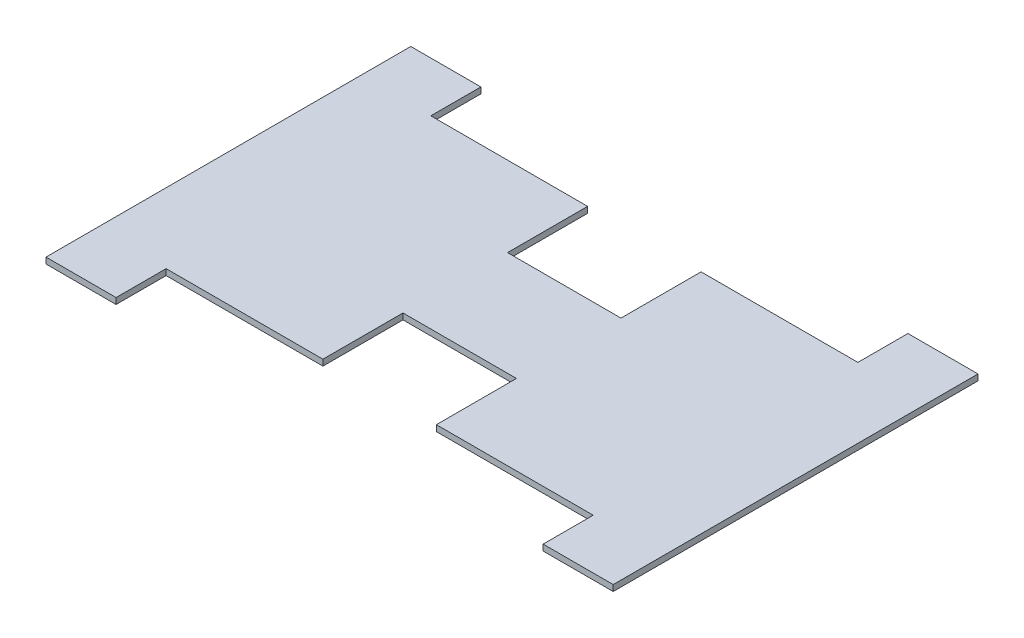
ISO-10303-21;
HEADER;
FILE_DESCRIPTION(('STEP AP214'),'2;1');
FILE_NAME('part.step','',(''),(''),'','','');
FILE_SCHEMA(('AUTOMOTIVE_DESIGN { 1 0 10303 214 1 1 1 1 }'));
ENDSEC;
DATA;
#1=APPLICATION_CONTEXT('core data for automotive mechanical design processes');
#2=APPLICATION_PROTOCOL_DEFINITION('international standard','automotive_design',2000,#1);
#3=PRODUCT_CONTEXT('',#1,'mechanical');
#4=PRODUCT('Part','Part','',(#3));
#5=PRODUCT_RELATED_PRODUCT_CATEGORY('part','',(#4));
#6=PRODUCT_DEFINITION_FORMATION('','',#4);
#7=PRODUCT_DEFINITION_CONTEXT('part definition',#1,'design');
#8=PRODUCT_DEFINITION('design','',#6,#7);
#9=PRODUCT_DEFINITION_SHAPE('','',#8);
#10=(LENGTH_UNIT() NAMED_UNIT(*) SI_UNIT(.MILLI.,.METRE.));
#11=(NAMED_UNIT(*) PLANE_ANGLE_UNIT() SI_UNIT($,.RADIAN.));
#12=(NAMED_UNIT(*) SI_UNIT($,.STERADIAN.) SOLID_ANGLE_UNIT());
#13=UNCERTAINTY_MEASURE_WITH_UNIT(LENGTH_MEASURE(1.E-05),#10,'distance_accuracy_value','');
#14=(GEOMETRIC_REPRESENTATION_CONTEXT(3) GLOBAL_UNCERTAINTY_ASSIGNED_CONTEXT((#13)) GLOBAL_UNIT_ASSIGNED_CONTEXT((#10,
#11,#12)) REPRESENTATION_CONTEXT('',''));
#15=CARTESIAN_POINT('',(0.,0.,0.));
#16=DIRECTION('',(0.,0.,1.));
#17=DIRECTION('',(1.,0.,0.));
#18=AXIS2_PLACEMENT_3D('',#15,#16,#17);
#19=CARTESIAN_POINT('',(304.8,8.636,-260.35));
#20=DIRECTION('',(0.,0.,1.));
#21=DIRECTION('',(1.,0.,0.));
#22=AXIS2_PLACEMENT_3D('',#19,#20,#21);
#23=PLANE('',#22);
#24=DIRECTION('',(-1.,0.,0.));
#25=VECTOR('',#24,1.);
#26=CARTESIAN_POINT('',(304.8,0.,-260.35));
#27=LINE('',#26,#25);
#28=CARTESIAN_POINT('',(404.8125,0.,-260.35));
#29=VERTEX_POINT('',#28);
#30=CARTESIAN_POINT('',(304.8,0.,-260.35));
#31=VERTEX_POINT('',#30);
#32=EDGE_CURVE('E204',#29,#31,#27,.T.);
#33=ORIENTED_EDGE('',*,*,#32,.T.);
#34=DIRECTION('',(0.,-1.,0.));
#35=VECTOR('',#34,1.);
#36=CARTESIAN_POINT('',(304.8,8.636,-260.35));
#37=LINE('',#36,#35);
#38=CARTESIAN_POINT('',(304.8,8.636,-260.35));
#39=VERTEX_POINT('',#38);
#40=EDGE_CURVE('E11',#39,#31,#37,.T.);
#41=ORIENTED_EDGE('',*,*,#40,.F.);
#42=DIRECTION('',(-1.,0.,0.));
#43=VECTOR('',#42,1.);
#44=CARTESIAN_POINT('',(304.8,8.636,-260.35));
#45=LINE('',#44,#43);
#46=CARTESIAN_POINT('',(404.8125,8.636,-260.35));
#47=VERTEX_POINT('',#46);
#48=EDGE_CURVE('E242',#47,#39,#45,.T.);
#49=ORIENTED_EDGE('',*,*,#48,.F.);
#50=DIRECTION('',(0.,-1.,0.));
#51=VECTOR('',#50,1.);
#52=CARTESIAN_POINT('',(404.8125,8.636,-260.35));
#53=LINE('',#52,#51);
#54=EDGE_CURVE('E200',#47,#29,#53,.T.);
#55=ORIENTED_EDGE('',*,*,#54,.T.);
#56=EDGE_LOOP('',(#33,#41,#49,#55));
#57=FACE_BOUND('',#56,.T.);
#58=ADVANCED_FACE('F36',(#57),#23,.F.);
#59=CARTESIAN_POINT('',(304.8,8.636,-260.35));
#60=DIRECTION('',(1.,0.,0.));
#61=DIRECTION('',(0.,0.,-1.));
#62=AXIS2_PLACEMENT_3D('',#59,#60,#61);
#63=PLANE('',#62);
#64=DIRECTION('',(0.,0.,1.));
#65=VECTOR('',#64,1.);
#66=CARTESIAN_POINT('',(304.8,0.,-260.35));
#67=LINE('',#66,#65);
#68=CARTESIAN_POINT('',(304.8,0.,-188.9125));
#69=VERTEX_POINT('',#68);
#70=EDGE_CURVE('E207',#31,#69,#67,.T.);
#71=ORIENTED_EDGE('',*,*,#70,.T.);
#72=DIRECTION('',(0.,-1.,0.));
#73=VECTOR('',#72,1.);
#74=CARTESIAN_POINT('',(304.8,8.636,-188.9125));
#75=LINE('',#74,#73);
#76=CARTESIAN_POINT('',(304.8,8.636,-188.9125));
#77=VERTEX_POINT('',#76);
#78=EDGE_CURVE('E44',#77,#69,#75,.T.);
#79=ORIENTED_EDGE('',*,*,#78,.F.);
#80=DIRECTION('',(0.,0.,1.));
#81=VECTOR('',#80,1.);
#82=CARTESIAN_POINT('',(304.8,8.636,-260.35));
#83=LINE('',#82,#81);
#84=EDGE_CURVE('E131',#39,#77,#83,.T.);
#85=ORIENTED_EDGE('',*,*,#84,.F.);
#86=ORIENTED_EDGE('',*,*,#40,.T.);
#87=EDGE_LOOP('',(#71,#79,#85,#86));
#88=FACE_BOUND('',#87,.T.);
#89=ADVANCED_FACE('F360',(#88),#63,.F.);
#90=CARTESIAN_POINT('',(304.8,8.636,-188.9125));
#91=DIRECTION('',(0.,0.,1.));
#92=DIRECTION('',(1.,0.,0.));
#93=AXIS2_PLACEMENT_3D('',#90,#91,#92);
#94=PLANE('',#93);
#95=DIRECTION('',(-1.,0.,0.));
#96=VECTOR('',#95,1.);
#97=CARTESIAN_POINT('',(304.8,0.,-188.9125));
#98=LINE('',#97,#96);
#99=CARTESIAN_POINT('',(80.9625000000001,0.,-188.9125));
#100=VERTEX_POINT('',#99);
#101=EDGE_CURVE('E209',#69,#100,#98,.T.);
#102=ORIENTED_EDGE('',*,*,#101,.T.);
#103=DIRECTION('',(0.,-1.,0.));
#104=VECTOR('',#103,1.);
#105=CARTESIAN_POINT('',(80.9625000000001,8.636,-188.9125));
#106=LINE('',#105,#104);
#107=CARTESIAN_POINT('',(80.9625000000001,8.636,-188.9125));
#108=VERTEX_POINT('',#107);
#109=EDGE_CURVE('E285',#108,#100,#106,.T.);
#110=ORIENTED_EDGE('',*,*,#109,.F.);
#111=DIRECTION('',(-1.,0.,0.));
#112=VECTOR('',#111,1.);
#113=CARTESIAN_POINT('',(304.8,8.636,-188.9125));
#114=LINE('',#113,#112);
#115=EDGE_CURVE('E293',#77,#108,#114,.T.);
#116=ORIENTED_EDGE('',*,*,#115,.F.);
#117=ORIENTED_EDGE('',*,*,#78,.T.);
#118=EDGE_LOOP('',(#102,#110,#116,#117));
#119=FACE_BOUND('',#118,.T.);
#120=ADVANCED_FACE('F291',(#119),#94,.F.);
#121=CARTESIAN_POINT('',(80.9625000000001,8.636,-188.9125));
#122=DIRECTION('',(1.,0.,0.));
#123=DIRECTION('',(0.,0.,-1.));
#124=AXIS2_PLACEMENT_3D('',#121,#122,#123);
#125=PLANE('',#124);
#126=DIRECTION('',(0.,0.,1.));
#127=VECTOR('',#126,1.);
#128=CARTESIAN_POINT('',(80.9625000000001,0.,-188.9125));
#129=LINE('',#128,#127);
#130=CARTESIAN_POINT('',(80.9625000000001,0.,-74.6125));
#131=VERTEX_POINT('',#130);
#132=EDGE_CURVE('E211',#100,#131,#129,.T.);
#133=ORIENTED_EDGE('',*,*,#132,.T.);
#134=DIRECTION('',(0.,-1.,0.));
#135=VECTOR('',#134,1.);
#136=CARTESIAN_POINT('',(80.9625000000001,8.636,-74.6125));
#137=LINE('',#136,#135);
#138=CARTESIAN_POINT('',(80.9625000000001,8.636,-74.6125));
#139=VERTEX_POINT('',#138);
#140=EDGE_CURVE('E282',#139,#131,#137,.T.);
#141=ORIENTED_EDGE('',*,*,#140,.F.);
#142=DIRECTION('',(0.,0.,1.));
#143=VECTOR('',#142,1.);
#144=CARTESIAN_POINT('',(80.9625000000001,8.636,-188.9125));
#145=LINE('',#144,#143);
#146=EDGE_CURVE('E311',#108,#139,#145,.T.);
#147=ORIENTED_EDGE('',*,*,#146,.F.);
#148=ORIENTED_EDGE('',*,*,#109,.T.);
#149=EDGE_LOOP('',(#133,#141,#147,#148));
#150=FACE_BOUND('',#149,.T.);
#151=ADVANCED_FACE('F302',(#150),#125,.F.);
#152=CARTESIAN_POINT('',(-80.9625,8.636,-74.6125));
#153=DIRECTION('',(0.,0.,1.));
#154=DIRECTION('',(1.,0.,0.));
#155=AXIS2_PLACEMENT_3D('',#152,#153,#154);
#156=PLANE('',#155);
#157=DIRECTION('',(-1.,0.,0.));
#158=VECTOR('',#157,1.);
#159=CARTESIAN_POINT('',(-80.9625,0.,-74.6125));
#160=LINE('',#159,#158);
#161=CARTESIAN_POINT('',(-80.9625,0.,-74.6125));
#162=VERTEX_POINT('',#161);
#163=EDGE_CURVE('E213',#131,#162,#160,.T.);
#164=ORIENTED_EDGE('',*,*,#163,.T.);
#165=DIRECTION('',(0.,-1.,0.));
#166=VECTOR('',#165,1.);
#167=CARTESIAN_POINT('',(-80.9625,8.636,-74.6125));
#168=LINE('',#167,#166);
#169=CARTESIAN_POINT('',(-80.9625,8.636,-74.6125));
#170=VERTEX_POINT('',#169);
#171=EDGE_CURVE('E279',#170,#162,#168,.T.);
#172=ORIENTED_EDGE('',*,*,#171,.F.);
#173=DIRECTION('',(-1.,0.,0.));
#174=VECTOR('',#173,1.);
#175=CARTESIAN_POINT('',(-80.9625,8.636,-74.6125));
#176=LINE('',#175,#174);
#177=EDGE_CURVE('E308',#139,#170,#176,.T.);
#178=ORIENTED_EDGE('',*,*,#177,.F.);
#179=ORIENTED_EDGE('',*,*,#140,.T.);
#180=EDGE_LOOP('',(#164,#172,#178,#179));
#181=FACE_BOUND('',#180,.T.);
#182=ADVANCED_FACE('F306',(#181),#156,.F.);
#183=CARTESIAN_POINT('',(-80.9625,8.636,-188.9125));
#184=DIRECTION('',(-1.,0.,0.));
#185=DIRECTION('',(0.,0.,1.));
#186=AXIS2_PLACEMENT_3D('',#183,#184,#185);
#187=PLANE('',#186);
#188=DIRECTION('',(0.,0.,-1.));
#189=VECTOR('',#188,1.);
#190=CARTESIAN_POINT('',(-80.9625,0.,-188.9125));
#191=LINE('',#190,#189);
#192=CARTESIAN_POINT('',(-80.9625,0.,-188.9125));
#193=VERTEX_POINT('',#192);
#194=EDGE_CURVE('E215',#162,#193,#191,.T.);
#195=ORIENTED_EDGE('',*,*,#194,.T.);
#196=DIRECTION('',(0.,-1.,0.));
#197=VECTOR('',#196,1.);
#198=CARTESIAN_POINT('',(-80.9625,8.636,-188.9125));
#199=LINE('',#198,#197);
#200=CARTESIAN_POINT('',(-80.9625,8.636,-188.9125));
#201=VERTEX_POINT('',#200);
#202=EDGE_CURVE('E276',#201,#193,#199,.T.);
#203=ORIENTED_EDGE('',*,*,#202,.F.);
#204=DIRECTION('',(0.,0.,-1.));
#205=VECTOR('',#204,1.);
#206=CARTESIAN_POINT('',(-80.9625,8.636,-188.9125));
#207=LINE('',#206,#205);
#208=EDGE_CURVE('E310',#170,#201,#207,.T.);
#209=ORIENTED_EDGE('',*,*,#208,.F.);
#210=ORIENTED_EDGE('',*,*,#171,.T.);
#211=EDGE_LOOP('',(#195,#203,#209,#210));
#212=FACE_BOUND('',#211,.T.);
#213=ADVANCED_FACE('F373',(#212),#187,.F.);
#214=CARTESIAN_POINT('',(-304.8,8.636,-188.9125));
#215=DIRECTION('',(0.,0.,1.));
#216=DIRECTION('',(1.,0.,0.));
#217=AXIS2_PLACEMENT_3D('',#214,#215,#216);
#218=PLANE('',#217);
#219=DIRECTION('',(-1.,0.,0.));
#220=VECTOR('',#219,1.);
#221=CARTESIAN_POINT('',(-304.8,0.,-188.9125));
#222=LINE('',#221,#220);
#223=CARTESIAN_POINT('',(-304.8,0.,-188.9125));
#224=VERTEX_POINT('',#223);
#225=EDGE_CURVE('E217',#193,#224,#222,.T.);
#226=ORIENTED_EDGE('',*,*,#225,.T.);
#227=DIRECTION('',(0.,-1.,0.));
#228=VECTOR('',#227,1.);
#229=CARTESIAN_POINT('',(-304.8,8.636,-188.9125));
#230=LINE('',#229,#228);
#231=CARTESIAN_POINT('',(-304.8,8.636,-188.9125));
#232=VERTEX_POINT('',#231);
#233=EDGE_CURVE('E273',#232,#224,#230,.T.);
#234=ORIENTED_EDGE('',*,*,#233,.F.);
#235=DIRECTION('',(-1.,0.,0.));
#236=VECTOR('',#235,1.);
#237=CARTESIAN_POINT('',(-304.8,8.636,-188.9125));
#238=LINE('',#237,#236);
#239=EDGE_CURVE('E313',#201,#232,#238,.T.);
#240=ORIENTED_EDGE('',*,*,#239,.F.);
#241=ORIENTED_EDGE('',*,*,#202,.T.);
#242=EDGE_LOOP('',(#226,#234,#240,#241));
#243=FACE_BOUND('',#242,.T.);
#244=ADVANCED_FACE('F376',(#243),#218,.F.);
#245=CARTESIAN_POINT('',(-304.8,8.636,-260.35));
#246=DIRECTION('',(-1.,0.,0.));
#247=DIRECTION('',(0.,0.,1.));
#248=AXIS2_PLACEMENT_3D('',#245,#246,#247);
#249=PLANE('',#248);
#250=DIRECTION('',(0.,0.,-1.));
#251=VECTOR('',#250,1.);
#252=CARTESIAN_POINT('',(-304.8,0.,-260.35));
#253=LINE('',#252,#251);
#254=CARTESIAN_POINT('',(-304.8,0.,-260.35));
#255=VERTEX_POINT('',#254);
#256=EDGE_CURVE('E219',#224,#255,#253,.T.);
#257=ORIENTED_EDGE('',*,*,#256,.T.);
#258=DIRECTION('',(0.,-1.,0.));
#259=VECTOR('',#258,1.);
#260=CARTESIAN_POINT('',(-304.8,8.636,-260.35));
#261=LINE('',#260,#259);
#262=CARTESIAN_POINT('',(-304.8,8.636,-260.35));
#263=VERTEX_POINT('',#262);
#264=EDGE_CURVE('E270',#263,#255,#261,.T.);
#265=ORIENTED_EDGE('',*,*,#264,.F.);
#266=DIRECTION('',(0.,0.,-1.));
#267=VECTOR('',#266,1.);
#268=CARTESIAN_POINT('',(-304.8,8.636,-260.35));
#269=LINE('',#268,#267);
#270=EDGE_CURVE('E319',#232,#263,#269,.T.);
#271=ORIENTED_EDGE('',*,*,#270,.F.);
#272=ORIENTED_EDGE('',*,*,#233,.T.);
#273=EDGE_LOOP('',(#257,#265,#271,#272));
#274=FACE_BOUND('',#273,.T.);
#275=ADVANCED_FACE('F380',(#274),#249,.F.);
#276=CARTESIAN_POINT('',(-404.8125,8.636,-260.35));
#277=DIRECTION('',(0.,0.,1.));
#278=DIRECTION('',(1.,0.,0.));
#279=AXIS2_PLACEMENT_3D('',#276,#277,#278);
#280=PLANE('',#279);
#281=DIRECTION('',(-1.,0.,0.));
#282=VECTOR('',#281,1.);
#283=CARTESIAN_POINT('',(-404.8125,0.,-260.35));
#284=LINE('',#283,#282);
#285=CARTESIAN_POINT('',(-404.8125,0.,-260.35));
#286=VERTEX_POINT('',#285);
#287=EDGE_CURVE('E221',#255,#286,#284,.T.);
#288=ORIENTED_EDGE('',*,*,#287,.T.);
#289=DIRECTION('',(0.,-1.,0.));
#290=VECTOR('',#289,1.);
#291=CARTESIAN_POINT('',(-404.8125,8.636,-260.35));
#292=LINE('',#291,#290);
#293=CARTESIAN_POINT('',(-404.8125,8.636,-260.35));
#294=VERTEX_POINT('',#293);
#295=EDGE_CURVE('E267',#294,#286,#292,.T.);
#296=ORIENTED_EDGE('',*,*,#295,.F.);
#297=DIRECTION('',(-1.,0.,0.));
#298=VECTOR('',#297,1.);
#299=CARTESIAN_POINT('',(-404.8125,8.636,-260.35));
#300=LINE('',#299,#298);
#301=EDGE_CURVE('E321',#263,#294,#300,.T.);
#302=ORIENTED_EDGE('',*,*,#301,.F.);
#303=ORIENTED_EDGE('',*,*,#264,.T.);
#304=EDGE_LOOP('',(#288,#296,#302,#303));
#305=FACE_BOUND('',#304,.T.);
#306=ADVANCED_FACE('F384',(#305),#280,.F.);
#307=CARTESIAN_POINT('',(-404.8125,8.636,260.35));
#308=DIRECTION('',(1.,0.,0.));
#309=DIRECTION('',(0.,0.,-1.));
#310=AXIS2_PLACEMENT_3D('',#307,#308,#309);
#311=PLANE('',#310);
#312=DIRECTION('',(0.,0.,1.));
#313=VECTOR('',#312,1.);
#314=CARTESIAN_POINT('',(-404.8125,0.,260.35));
#315=LINE('',#314,#313);
#316=CARTESIAN_POINT('',(-404.8125,0.,260.35));
#317=VERTEX_POINT('',#316);
#318=EDGE_CURVE('E223',#286,#317,#315,.T.);
#319=ORIENTED_EDGE('',*,*,#318,.T.);
#320=DIRECTION('',(0.,-1.,0.));
#321=VECTOR('',#320,1.);
#322=CARTESIAN_POINT('',(-404.8125,8.636,260.35));
#323=LINE('',#322,#321);
#324=CARTESIAN_POINT('',(-404.8125,8.636,260.35));
#325=VERTEX_POINT('',#324);
#326=EDGE_CURVE('E264',#325,#317,#323,.T.);
#327=ORIENTED_EDGE('',*,*,#326,.F.);
#328=DIRECTION('',(0.,0.,1.));
#329=VECTOR('',#328,1.);
#330=CARTESIAN_POINT('',(-404.8125,8.636,260.35));
#331=LINE('',#330,#329);
#332=EDGE_CURVE('E323',#294,#325,#331,.T.);
#333=ORIENTED_EDGE('',*,*,#332,.F.);
#334=ORIENTED_EDGE('',*,*,#295,.T.);
#335=EDGE_LOOP('',(#319,#327,#333,#334));
#336=FACE_BOUND('',#335,.T.);
#337=ADVANCED_FACE('F388',(#336),#311,.F.);
#338=CARTESIAN_POINT('',(-404.8125,8.636,260.35));
#339=DIRECTION('',(0.,0.,-1.));
#340=DIRECTION('',(-1.,0.,0.));
#341=AXIS2_PLACEMENT_3D('',#338,#339,#340);
#342=PLANE('',#341);
#343=DIRECTION('',(1.,0.,0.));
#344=VECTOR('',#343,1.);
#345=CARTESIAN_POINT('',(-404.8125,0.,260.35));
#346=LINE('',#345,#344);
#347=CARTESIAN_POINT('',(-304.8,0.,260.35));
#348=VERTEX_POINT('',#347);
#349=EDGE_CURVE('E225',#317,#348,#346,.T.);
#350=ORIENTED_EDGE('',*,*,#349,.T.);
#351=DIRECTION('',(0.,-1.,0.));
#352=VECTOR('',#351,1.);
#353=CARTESIAN_POINT('',(-304.8,8.636,260.35));
#354=LINE('',#353,#352);
#355=CARTESIAN_POINT('',(-304.8,8.636,260.35));
#356=VERTEX_POINT('',#355);
#357=EDGE_CURVE('E261',#356,#348,#354,.T.);
#358=ORIENTED_EDGE('',*,*,#357,.F.);
#359=DIRECTION('',(1.,0.,0.));
#360=VECTOR('',#359,1.);
#361=CARTESIAN_POINT('',(-404.8125,8.636,260.35));
#362=LINE('',#361,#360);
#363=EDGE_CURVE('E325',#325,#356,#362,.T.);
#364=ORIENTED_EDGE('',*,*,#363,.F.);
#365=ORIENTED_EDGE('',*,*,#326,.T.);
#366=EDGE_LOOP('',(#350,#358,#364,#365));
#367=FACE_BOUND('',#366,.T.);
#368=ADVANCED_FACE('F392',(#367),#342,.F.);
#369=CARTESIAN_POINT('',(-304.8,8.636,260.35));
#370=DIRECTION('',(-1.,0.,0.));
#371=DIRECTION('',(0.,0.,1.));
#372=AXIS2_PLACEMENT_3D('',#369,#370,#371);
#373=PLANE('',#372);
#374=DIRECTION('',(0.,0.,-1.));
#375=VECTOR('',#374,1.);
#376=CARTESIAN_POINT('',(-304.8,0.,260.35));
#377=LINE('',#376,#375);
#378=CARTESIAN_POINT('',(-304.8,0.,188.9125));
#379=VERTEX_POINT('',#378);
#380=EDGE_CURVE('E227',#348,#379,#377,.T.);
#381=ORIENTED_EDGE('',*,*,#380,.T.);
#382=DIRECTION('',(0.,-1.,0.));
#383=VECTOR('',#382,1.);
#384=CARTESIAN_POINT('',(-304.8,8.636,188.9125));
#385=LINE('',#384,#383);
#386=CARTESIAN_POINT('',(-304.8,8.636,188.9125));
#387=VERTEX_POINT('',#386);
#388=EDGE_CURVE('E258',#387,#379,#385,.T.);
#389=ORIENTED_EDGE('',*,*,#388,.F.);
#390=DIRECTION('',(0.,0.,-1.));
#391=VECTOR('',#390,1.);
#392=CARTESIAN_POINT('',(-304.8,8.636,260.35));
#393=LINE('',#392,#391);
#394=EDGE_CURVE('E327',#356,#387,#393,.T.);
#395=ORIENTED_EDGE('',*,*,#394,.F.);
#396=ORIENTED_EDGE('',*,*,#357,.T.);
#397=EDGE_LOOP('',(#381,#389,#395,#396));
#398=FACE_BOUND('',#397,.T.);
#399=ADVANCED_FACE('F396',(#398),#373,.F.);
#400=CARTESIAN_POINT('',(-304.8,8.636,188.9125));
#401=DIRECTION('',(0.,0.,-1.));
#402=DIRECTION('',(-1.,0.,0.));
#403=AXIS2_PLACEMENT_3D('',#400,#401,#402);
#404=PLANE('',#403);
#405=DIRECTION('',(1.,0.,0.));
#406=VECTOR('',#405,1.);
#407=CARTESIAN_POINT('',(-304.8,0.,188.9125));
#408=LINE('',#407,#406);
#409=CARTESIAN_POINT('',(-80.9625,0.,188.9125));
#410=VERTEX_POINT('',#409);
#411=EDGE_CURVE('E229',#379,#410,#408,.T.);
#412=ORIENTED_EDGE('',*,*,#411,.T.);
#413=DIRECTION('',(0.,-1.,0.));
#414=VECTOR('',#413,1.);
#415=CARTESIAN_POINT('',(-80.9625,8.636,188.9125));
#416=LINE('',#415,#414);
#417=CARTESIAN_POINT('',(-80.9625,8.636,188.9125));
#418=VERTEX_POINT('',#417);
#419=EDGE_CURVE('E255',#418,#410,#416,.T.);
#420=ORIENTED_EDGE('',*,*,#419,.F.);
#421=DIRECTION('',(1.,0.,0.));
#422=VECTOR('',#421,1.);
#423=CARTESIAN_POINT('',(-304.8,8.636,188.9125));
#424=LINE('',#423,#422);
#425=EDGE_CURVE('E329',#387,#418,#424,.T.);
#426=ORIENTED_EDGE('',*,*,#425,.F.);
#427=ORIENTED_EDGE('',*,*,#388,.T.);
#428=EDGE_LOOP('',(#412,#420,#426,#427));
#429=FACE_BOUND('',#428,.T.);
#430=ADVANCED_FACE('F400',(#429),#404,.F.);
#431=CARTESIAN_POINT('',(-80.9625,8.636,188.9125));
#432=DIRECTION('',(-1.,0.,0.));
#433=DIRECTION('',(0.,0.,1.));
#434=AXIS2_PLACEMENT_3D('',#431,#432,#433);
#435=PLANE('',#434);
#436=DIRECTION('',(0.,0.,-1.));
#437=VECTOR('',#436,1.);
#438=CARTESIAN_POINT('',(-80.9625,0.,188.9125));
#439=LINE('',#438,#437);
#440=CARTESIAN_POINT('',(-80.9625,0.,74.6125));
#441=VERTEX_POINT('',#440);
#442=EDGE_CURVE('E231',#410,#441,#439,.T.);
#443=ORIENTED_EDGE('',*,*,#442,.T.);
#444=DIRECTION('',(0.,-1.,0.));
#445=VECTOR('',#444,1.);
#446=CARTESIAN_POINT('',(-80.9625,8.636,74.6125));
#447=LINE('',#446,#445);
#448=CARTESIAN_POINT('',(-80.9625,8.636,74.6125));
#449=VERTEX_POINT('',#448);
#450=EDGE_CURVE('E252',#449,#441,#447,.T.);
#451=ORIENTED_EDGE('',*,*,#450,.F.);
#452=DIRECTION('',(0.,0.,-1.));
#453=VECTOR('',#452,1.);
#454=CARTESIAN_POINT('',(-80.9625,8.636,188.9125));
#455=LINE('',#454,#453);
#456=EDGE_CURVE('E331',#418,#449,#455,.T.);
#457=ORIENTED_EDGE('',*,*,#456,.F.);
#458=ORIENTED_EDGE('',*,*,#419,.T.);
#459=EDGE_LOOP('',(#443,#451,#457,#458));
#460=FACE_BOUND('',#459,.T.);
#461=ADVANCED_FACE('F404',(#460),#435,.F.);
#462=CARTESIAN_POINT('',(-80.9625,8.636,74.6125));
#463=DIRECTION('',(0.,0.,-1.));
#464=DIRECTION('',(-1.,0.,0.));
#465=AXIS2_PLACEMENT_3D('',#462,#463,#464);
#466=PLANE('',#465);
#467=DIRECTION('',(1.,0.,0.));
#468=VECTOR('',#467,1.);
#469=CARTESIAN_POINT('',(-80.9625,0.,74.6125));
#470=LINE('',#469,#468);
#471=CARTESIAN_POINT('',(80.9625000000001,0.,74.6125));
#472=VERTEX_POINT('',#471);
#473=EDGE_CURVE('E233',#441,#472,#470,.T.);
#474=ORIENTED_EDGE('',*,*,#473,.T.);
#475=DIRECTION('',(0.,-1.,0.));
#476=VECTOR('',#475,1.);
#477=CARTESIAN_POINT('',(80.9625000000001,8.636,74.6125));
#478=LINE('',#477,#476);
#479=CARTESIAN_POINT('',(80.9625000000001,8.636,74.6125));
#480=VERTEX_POINT('',#479);
#481=EDGE_CURVE('E249',#480,#472,#478,.T.);
#482=ORIENTED_EDGE('',*,*,#481,.F.);
#483=DIRECTION('',(1.,0.,0.));
#484=VECTOR('',#483,1.);
#485=CARTESIAN_POINT('',(-80.9625,8.636,74.6125));
#486=LINE('',#485,#484);
#487=EDGE_CURVE('E333',#449,#480,#486,.T.);
#488=ORIENTED_EDGE('',*,*,#487,.F.);
#489=ORIENTED_EDGE('',*,*,#450,.T.);
#490=EDGE_LOOP('',(#474,#482,#488,#489));
#491=FACE_BOUND('',#490,.T.);
#492=ADVANCED_FACE('F408',(#491),#466,.F.);
#493=CARTESIAN_POINT('',(80.9625000000001,8.636,188.9125));
#494=DIRECTION('',(1.,0.,0.));
#495=DIRECTION('',(0.,0.,-1.));
#496=AXIS2_PLACEMENT_3D('',#493,#494,#495);
#497=PLANE('',#496);
#498=DIRECTION('',(0.,0.,1.));
#499=VECTOR('',#498,1.);
#500=CARTESIAN_POINT('',(80.9625000000001,0.,188.9125));
#501=LINE('',#500,#499);
#502=CARTESIAN_POINT('',(80.9625000000001,0.,188.9125));
#503=VERTEX_POINT('',#502);
#504=EDGE_CURVE('E235',#472,#503,#501,.T.);
#505=ORIENTED_EDGE('',*,*,#504,.T.);
#506=DIRECTION('',(0.,-1.,0.));
#507=VECTOR('',#506,1.);
#508=CARTESIAN_POINT('',(80.9625000000001,8.636,188.9125));
#509=LINE('',#508,#507);
#510=CARTESIAN_POINT('',(80.9625000000001,8.636,188.9125));
#511=VERTEX_POINT('',#510);
#512=EDGE_CURVE('E246',#511,#503,#509,.T.);
#513=ORIENTED_EDGE('',*,*,#512,.F.);
#514=DIRECTION('',(0.,0.,1.));
#515=VECTOR('',#514,1.);
#516=CARTESIAN_POINT('',(80.9625000000001,8.636,188.9125));
#517=LINE('',#516,#515);
#518=EDGE_CURVE('E335',#480,#511,#517,.T.);
#519=ORIENTED_EDGE('',*,*,#518,.F.);
#520=ORIENTED_EDGE('',*,*,#481,.T.);
#521=EDGE_LOOP('',(#505,#513,#519,#520));
#522=FACE_BOUND('',#521,.T.);
#523=ADVANCED_FACE('F341',(#522),#497,.F.);
#524=CARTESIAN_POINT('',(304.8,8.636,188.9125));
#525=DIRECTION('',(0.,0.,-1.));
#526=DIRECTION('',(-1.,0.,0.));
#527=AXIS2_PLACEMENT_3D('',#524,#525,#526);
#528=PLANE('',#527);
#529=DIRECTION('',(1.,0.,0.));
#530=VECTOR('',#529,1.);
#531=CARTESIAN_POINT('',(304.8,0.,188.9125));
#532=LINE('',#531,#530);
#533=CARTESIAN_POINT('',(304.8,0.,188.9125));
#534=VERTEX_POINT('',#533);
#535=EDGE_CURVE('E237',#503,#534,#532,.T.);
#536=ORIENTED_EDGE('',*,*,#535,.T.);
#537=DIRECTION('',(0.,-1.,0.));
#538=VECTOR('',#537,1.);
#539=CARTESIAN_POINT('',(304.8,8.636,188.9125));
#540=LINE('',#539,#538);
#541=CARTESIAN_POINT('',(304.8,8.636,188.9125));
#542=VERTEX_POINT('',#541);
#543=EDGE_CURVE('E195',#542,#534,#540,.T.);
#544=ORIENTED_EDGE('',*,*,#543,.F.);
#545=DIRECTION('',(1.,0.,0.));
#546=VECTOR('',#545,1.);
#547=CARTESIAN_POINT('',(304.8,8.636,188.9125));
#548=LINE('',#547,#546);
#549=EDGE_CURVE('E186',#511,#542,#548,.T.);
#550=ORIENTED_EDGE('',*,*,#549,.F.);
#551=ORIENTED_EDGE('',*,*,#512,.T.);
#552=EDGE_LOOP('',(#536,#544,#550,#551));
#553=FACE_BOUND('',#552,.T.);
#554=ADVANCED_FACE('F345',(#553),#528,.F.);
#555=CARTESIAN_POINT('',(304.8,8.636,260.35));
#556=DIRECTION('',(1.,0.,0.));
#557=DIRECTION('',(0.,0.,-1.));
#558=AXIS2_PLACEMENT_3D('',#555,#556,#557);
#559=PLANE('',#558);
#560=DIRECTION('',(0.,0.,1.));
#561=VECTOR('',#560,1.);
#562=CARTESIAN_POINT('',(304.8,0.,260.35));
#563=LINE('',#562,#561);
#564=CARTESIAN_POINT('',(304.8,0.,260.35));
#565=VERTEX_POINT('',#564);
#566=EDGE_CURVE('E194',#534,#565,#563,.T.);
#567=ORIENTED_EDGE('',*,*,#566,.T.);
#568=DIRECTION('',(0.,-1.,0.));
#569=VECTOR('',#568,1.);
#570=CARTESIAN_POINT('',(304.8,8.636,260.35));
#571=LINE('',#570,#569);
#572=CARTESIAN_POINT('',(304.8,8.636,260.35));
#573=VERTEX_POINT('',#572);
#574=EDGE_CURVE('E191',#573,#565,#571,.T.);
#575=ORIENTED_EDGE('',*,*,#574,.F.);
#576=DIRECTION('',(0.,0.,1.));
#577=VECTOR('',#576,1.);
#578=CARTESIAN_POINT('',(304.8,8.636,260.35));
#579=LINE('',#578,#577);
#580=EDGE_CURVE('E180',#542,#573,#579,.T.);
#581=ORIENTED_EDGE('',*,*,#580,.F.);
#582=ORIENTED_EDGE('',*,*,#543,.T.);
#583=EDGE_LOOP('',(#567,#575,#581,#582));
#584=FACE_BOUND('',#583,.T.);
#585=ADVANCED_FACE('F192',(#584),#559,.F.);
#586=CARTESIAN_POINT('',(304.8,8.636,260.35));
#587=DIRECTION('',(0.,0.,-1.));
#588=DIRECTION('',(-1.,0.,0.));
#589=AXIS2_PLACEMENT_3D('',#586,#587,#588);
#590=PLANE('',#589);
#591=DIRECTION('',(1.,0.,0.));
#592=VECTOR('',#591,1.);
#593=CARTESIAN_POINT('',(304.8,0.,260.35));
#594=LINE('',#593,#592);
#595=CARTESIAN_POINT('',(404.8125,0.,260.35));
#596=VERTEX_POINT('',#595);
#597=EDGE_CURVE('E117',#565,#596,#594,.T.);
#598=ORIENTED_EDGE('',*,*,#597,.T.);
#599=DIRECTION('',(0.,-1.,0.));
#600=VECTOR('',#599,1.);
#601=CARTESIAN_POINT('',(404.8125,8.636,260.35));
#602=LINE('',#601,#600);
#603=CARTESIAN_POINT('',(404.8125,8.636,260.35));
#604=VERTEX_POINT('',#603);
#605=EDGE_CURVE('E196',#604,#596,#602,.T.);
#606=ORIENTED_EDGE('',*,*,#605,.F.);
#607=DIRECTION('',(1.,0.,0.));
#608=VECTOR('',#607,1.);
#609=CARTESIAN_POINT('',(304.8,8.636,260.35));
#610=LINE('',#609,#608);
#611=EDGE_CURVE('E184',#573,#604,#610,.T.);
#612=ORIENTED_EDGE('',*,*,#611,.F.);
#613=ORIENTED_EDGE('',*,*,#574,.T.);
#614=EDGE_LOOP('',(#598,#606,#612,#613));
#615=FACE_BOUND('',#614,.T.);
#616=ADVANCED_FACE('F198',(#615),#590,.F.);
#617=CARTESIAN_POINT('',(404.8125,8.636,260.35));
#618=DIRECTION('',(-1.,0.,0.));
#619=DIRECTION('',(0.,0.,1.));
#620=AXIS2_PLACEMENT_3D('',#617,#618,#619);
#621=PLANE('',#620);
#622=DIRECTION('',(0.,0.,-1.));
#623=VECTOR('',#622,1.);
#624=CARTESIAN_POINT('',(404.8125,0.,260.35));
#625=LINE('',#624,#623);
#626=EDGE_CURVE('E123',#596,#29,#625,.T.);
#627=ORIENTED_EDGE('',*,*,#626,.T.);
#628=ORIENTED_EDGE('',*,*,#54,.F.);
#629=DIRECTION('',(0.,0.,-1.));
#630=VECTOR('',#629,1.);
#631=CARTESIAN_POINT('',(404.8125,8.636,260.35));
#632=LINE('',#631,#630);
#633=EDGE_CURVE('E52',#604,#47,#632,.T.);
#634=ORIENTED_EDGE('',*,*,#633,.F.);
#635=ORIENTED_EDGE('',*,*,#605,.T.);
#636=EDGE_LOOP('',(#627,#628,#634,#635));
#637=FACE_BOUND('',#636,.T.);
#638=ADVANCED_FACE('F349',(#637),#621,.F.);
#639=CARTESIAN_POINT('',(0.,8.636,0.));
#640=DIRECTION('',(0.,1.,0.));
#641=DIRECTION('',(0.,0.,1.));
#642=AXIS2_PLACEMENT_3D('',#639,#640,#641);
#643=PLANE('',#642);
#644=ORIENTED_EDGE('',*,*,#48,.T.);
#645=ORIENTED_EDGE('',*,*,#84,.T.);
#646=ORIENTED_EDGE('',*,*,#115,.T.);
#647=ORIENTED_EDGE('',*,*,#146,.T.);
#648=ORIENTED_EDGE('',*,*,#177,.T.);
#649=ORIENTED_EDGE('',*,*,#208,.T.);
#650=ORIENTED_EDGE('',*,*,#239,.T.);
#651=ORIENTED_EDGE('',*,*,#270,.T.);
#652=ORIENTED_EDGE('',*,*,#301,.T.);
#653=ORIENTED_EDGE('',*,*,#332,.T.);
#654=ORIENTED_EDGE('',*,*,#363,.T.);
#655=ORIENTED_EDGE('',*,*,#394,.T.);
#656=ORIENTED_EDGE('',*,*,#425,.T.);
#657=ORIENTED_EDGE('',*,*,#456,.T.);
#658=ORIENTED_EDGE('',*,*,#487,.T.);
#659=ORIENTED_EDGE('',*,*,#518,.T.);
#660=ORIENTED_EDGE('',*,*,#549,.T.);
#661=ORIENTED_EDGE('',*,*,#580,.T.);
#662=ORIENTED_EDGE('',*,*,#611,.T.);
#663=ORIENTED_EDGE('',*,*,#633,.T.);
#664=EDGE_LOOP('',(#644,#645,#646,#647,#648,#649,#650,#651,#652,#653,#654,#655,#656,#657,#658,
#659,#660,#661,#662,#663));
#665=FACE_BOUND('',#664,.T.);
#666=ADVANCED_FACE('F182',(#665),#643,.T.);
#667=CARTESIAN_POINT('',(0.,0.,0.));
#668=DIRECTION('',(0.,1.,0.));
#669=DIRECTION('',(0.,0.,1.));
#670=AXIS2_PLACEMENT_3D('',#667,#668,#669);
#671=PLANE('',#670);
#672=ORIENTED_EDGE('',*,*,#32,.F.);
#673=ORIENTED_EDGE('',*,*,#626,.F.);
#674=ORIENTED_EDGE('',*,*,#597,.F.);
#675=ORIENTED_EDGE('',*,*,#566,.F.);
#676=ORIENTED_EDGE('',*,*,#535,.F.);
#677=ORIENTED_EDGE('',*,*,#504,.F.);
#678=ORIENTED_EDGE('',*,*,#473,.F.);
#679=ORIENTED_EDGE('',*,*,#442,.F.);
#680=ORIENTED_EDGE('',*,*,#411,.F.);
#681=ORIENTED_EDGE('',*,*,#380,.F.);
#682=ORIENTED_EDGE('',*,*,#349,.F.);
#683=ORIENTED_EDGE('',*,*,#318,.F.);
#684=ORIENTED_EDGE('',*,*,#287,.F.);
#685=ORIENTED_EDGE('',*,*,#256,.F.);
#686=ORIENTED_EDGE('',*,*,#225,.F.);
#687=ORIENTED_EDGE('',*,*,#194,.F.);
#688=ORIENTED_EDGE('',*,*,#163,.F.);
#689=ORIENTED_EDGE('',*,*,#132,.F.);
#690=ORIENTED_EDGE('',*,*,#101,.F.);
#691=ORIENTED_EDGE('',*,*,#70,.F.);
#692=EDGE_LOOP('',(#672,#673,#674,#675,#676,#677,#678,#679,#680,#681,#682,#683,#684,#685,#686,
#687,#688,#689,#690,#691));
#693=FACE_BOUND('',#692,.T.);
#694=ADVANCED_FACE('F297',(#693),#671,.F.);
#695=CLOSED_SHELL('',(#58,#89,#120,#151,#182,#213,#244,#275,#306,#337,#368,#399,#430,#461,#492,
#523,#554,#585,#616,#638,#666,#694));
#696=MANIFOLD_SOLID_BREP('B2',#695);
#697=ADVANCED_BREP_SHAPE_REPRESENTATION('',(#18,#696),#14);
#698=SHAPE_DEFINITION_REPRESENTATION(#9,#697);
ENDSEC;
END-ISO-10303-21;
